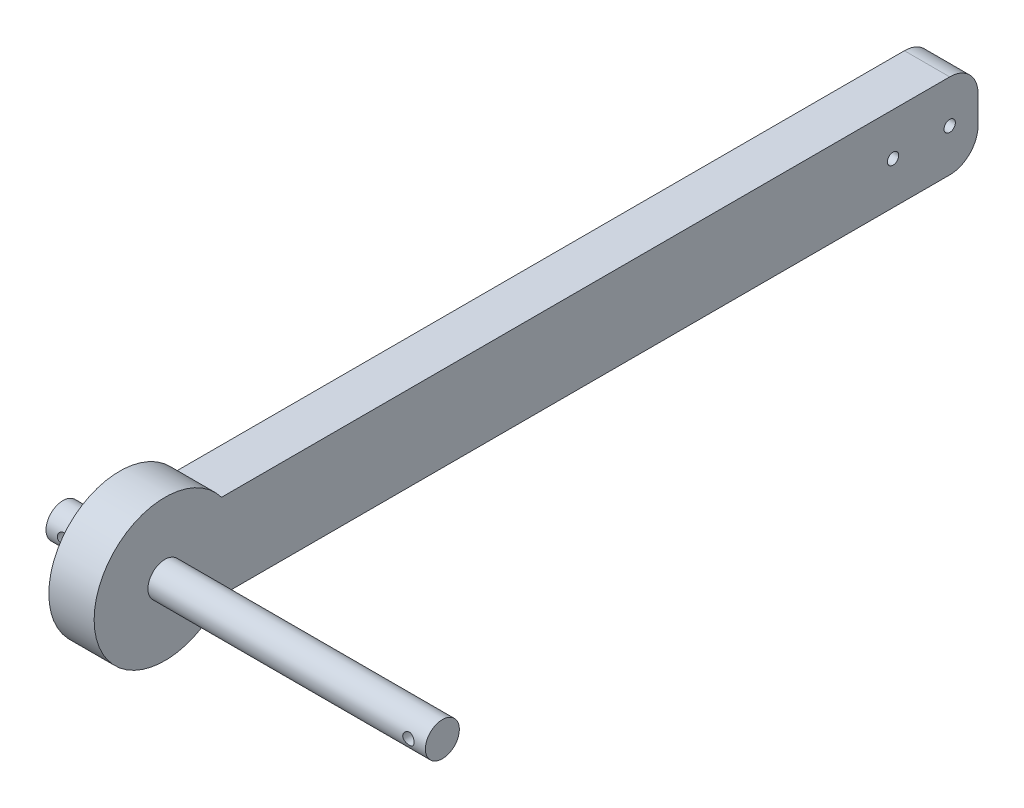
ISO-10303-21;
HEADER;
FILE_DESCRIPTION(('STEP AP214'),'2;1');
FILE_NAME('part.step','',(''),(''),'','','');
FILE_SCHEMA(('AUTOMOTIVE_DESIGN { 1 0 10303 214 1 1 1 1 }'));
ENDSEC;
DATA;
#1=APPLICATION_CONTEXT('core data for automotive mechanical design processes');
#2=APPLICATION_PROTOCOL_DEFINITION('international standard','automotive_design',2000,#1);
#3=PRODUCT_CONTEXT('',#1,'mechanical');
#4=PRODUCT('Part','Part','',(#3));
#5=PRODUCT_RELATED_PRODUCT_CATEGORY('part','',(#4));
#6=PRODUCT_DEFINITION_FORMATION('','',#4);
#7=PRODUCT_DEFINITION_CONTEXT('part definition',#1,'design');
#8=PRODUCT_DEFINITION('design','',#6,#7);
#9=PRODUCT_DEFINITION_SHAPE('','',#8);
#10=(LENGTH_UNIT() NAMED_UNIT(*) SI_UNIT(.MILLI.,.METRE.));
#11=(NAMED_UNIT(*) PLANE_ANGLE_UNIT() SI_UNIT($,.RADIAN.));
#12=(NAMED_UNIT(*) SI_UNIT($,.STERADIAN.) SOLID_ANGLE_UNIT());
#13=UNCERTAINTY_MEASURE_WITH_UNIT(LENGTH_MEASURE(1.E-05),#10,'distance_accuracy_value','');
#14=(GEOMETRIC_REPRESENTATION_CONTEXT(3) GLOBAL_UNCERTAINTY_ASSIGNED_CONTEXT((#13)) GLOBAL_UNIT_ASSIGNED_CONTEXT((#10,
#11,#12)) REPRESENTATION_CONTEXT('',''));
#15=CARTESIAN_POINT('',(0.,0.,0.));
#16=DIRECTION('',(0.,0.,1.));
#17=DIRECTION('',(1.,0.,0.));
#18=AXIS2_PLACEMENT_3D('',#15,#16,#17);
#19=CARTESIAN_POINT('',(8.,0.,0.));
#20=DIRECTION('',(0.,1.,0.));
#21=DIRECTION('',(0.,0.,1.));
#22=AXIS2_PLACEMENT_3D('',#19,#20,#21);
#23=PLANE('',#22);
#24=DIRECTION('',(0.,0.,-1.));
#25=VECTOR('',#24,1.);
#26=CARTESIAN_POINT('',(8.,0.,0.));
#27=LINE('',#26,#25);
#28=CARTESIAN_POINT('',(8.,0.,-16.4));
#29=VERTEX_POINT('',#28);
#30=CARTESIAN_POINT('',(8.,0.,-145.));
#31=VERTEX_POINT('',#30);
#32=EDGE_CURVE('E63',#29,#31,#27,.T.);
#33=ORIENTED_EDGE('',*,*,#32,.F.);
#34=DIRECTION('',(1.,0.,0.));
#35=VECTOR('',#34,1.);
#36=CARTESIAN_POINT('',(-35.3553390593274,0.,-16.4));
#37=LINE('',#36,#35);
#38=CARTESIAN_POINT('',(0.,0.,-16.4));
#39=VERTEX_POINT('',#38);
#40=EDGE_CURVE('E100',#29,#39,#37,.F.);
#41=ORIENTED_EDGE('',*,*,#40,.T.);
#42=DIRECTION('',(0.,0.,-1.));
#43=VECTOR('',#42,1.);
#44=CARTESIAN_POINT('',(0.,0.,0.));
#45=LINE('',#44,#43);
#46=CARTESIAN_POINT('',(0.,0.,-145.));
#47=VERTEX_POINT('',#46);
#48=EDGE_CURVE('E122',#39,#47,#45,.T.);
#49=ORIENTED_EDGE('',*,*,#48,.T.);
#50=DIRECTION('',(-1.,0.,0.));
#51=VECTOR('',#50,1.);
#52=CARTESIAN_POINT('',(8.,0.,-145.));
#53=LINE('',#52,#51);
#54=EDGE_CURVE('E135',#47,#31,#53,.F.);
#55=ORIENTED_EDGE('',*,*,#54,.T.);
#56=EDGE_LOOP('',(#33,#41,#49,#55));
#57=FACE_BOUND('',#56,.T.);
#58=ADVANCED_FACE('F41',(#57),#23,.F.);
#59=CARTESIAN_POINT('',(8.,0.,-150.));
#60=DIRECTION('',(0.,0.,1.));
#61=DIRECTION('',(1.,0.,0.));
#62=AXIS2_PLACEMENT_3D('',#59,#60,#61);
#63=PLANE('',#62);
#64=DIRECTION('',(0.,1.,0.));
#65=VECTOR('',#64,1.);
#66=CARTESIAN_POINT('',(8.,0.,-150.));
#67=LINE('',#66,#65);
#68=CARTESIAN_POINT('',(8.,5.,-150.));
#69=VERTEX_POINT('',#68);
#70=CARTESIAN_POINT('',(8.,10.,-150.));
#71=VERTEX_POINT('',#70);
#72=EDGE_CURVE('E115',#69,#71,#67,.T.);
#73=ORIENTED_EDGE('',*,*,#72,.F.);
#74=DIRECTION('',(-1.,0.,0.));
#75=VECTOR('',#74,1.);
#76=CARTESIAN_POINT('',(8.,5.,-150.));
#77=LINE('',#76,#75);
#78=CARTESIAN_POINT('',(0.,5.,-150.));
#79=VERTEX_POINT('',#78);
#80=EDGE_CURVE('E117',#69,#79,#77,.T.);
#81=ORIENTED_EDGE('',*,*,#80,.T.);
#82=DIRECTION('',(0.,1.,0.));
#83=VECTOR('',#82,1.);
#84=CARTESIAN_POINT('',(0.,0.,-150.));
#85=LINE('',#84,#83);
#86=CARTESIAN_POINT('',(0.,10.,-150.));
#87=VERTEX_POINT('',#86);
#88=EDGE_CURVE('E124',#79,#87,#85,.T.);
#89=ORIENTED_EDGE('',*,*,#88,.T.);
#90=DIRECTION('',(-1.,0.,0.));
#91=VECTOR('',#90,1.);
#92=CARTESIAN_POINT('',(8.,10.,-150.));
#93=LINE('',#92,#91);
#94=EDGE_CURVE('E114',#87,#71,#93,.F.);
#95=ORIENTED_EDGE('',*,*,#94,.T.);
#96=EDGE_LOOP('',(#73,#81,#89,#95));
#97=FACE_BOUND('',#96,.T.);
#98=ADVANCED_FACE('F155',(#97),#63,.F.);
#99=CARTESIAN_POINT('',(8.,15.,0.));
#100=DIRECTION('',(0.,-1.,0.));
#101=DIRECTION('',(0.,0.,-1.));
#102=AXIS2_PLACEMENT_3D('',#99,#100,#101);
#103=PLANE('',#102);
#104=DIRECTION('',(0.,0.,1.));
#105=VECTOR('',#104,1.);
#106=CARTESIAN_POINT('',(0.,15.,0.));
#107=LINE('',#106,#105);
#108=CARTESIAN_POINT('',(0.,15.,-145.));
#109=VERTEX_POINT('',#108);
#110=CARTESIAN_POINT('',(0.,15.,-16.4));
#111=VERTEX_POINT('',#110);
#112=EDGE_CURVE('E111',#109,#111,#107,.T.);
#113=ORIENTED_EDGE('',*,*,#112,.T.);
#114=DIRECTION('',(1.,0.,0.));
#115=VECTOR('',#114,1.);
#116=CARTESIAN_POINT('',(-35.3553390593274,15.,-16.4));
#117=LINE('',#116,#115);
#118=CARTESIAN_POINT('',(8.,15.,-16.4));
#119=VERTEX_POINT('',#118);
#120=EDGE_CURVE('E97',#111,#119,#117,.T.);
#121=ORIENTED_EDGE('',*,*,#120,.T.);
#122=DIRECTION('',(0.,0.,1.));
#123=VECTOR('',#122,1.);
#124=CARTESIAN_POINT('',(8.,15.,0.));
#125=LINE('',#124,#123);
#126=CARTESIAN_POINT('',(8.,15.,-145.));
#127=VERTEX_POINT('',#126);
#128=EDGE_CURVE('E108',#127,#119,#125,.T.);
#129=ORIENTED_EDGE('',*,*,#128,.F.);
#130=DIRECTION('',(-1.,0.,0.));
#131=VECTOR('',#130,1.);
#132=CARTESIAN_POINT('',(8.,15.,-145.));
#133=LINE('',#132,#131);
#134=EDGE_CURVE('E49',#127,#109,#133,.T.);
#135=ORIENTED_EDGE('',*,*,#134,.T.);
#136=EDGE_LOOP('',(#113,#121,#129,#135));
#137=FACE_BOUND('',#136,.T.);
#138=ADVANCED_FACE('F106',(#137),#103,.F.);
#139=CARTESIAN_POINT('',(8.,0.,0.));
#140=DIRECTION('',(-1.,0.,0.));
#141=DIRECTION('',(0.,0.,1.));
#142=AXIS2_PLACEMENT_3D('',#139,#140,#141);
#143=PLANE('',#142);
#144=CARTESIAN_POINT('',(8.,7.5,-6.4));
#145=DIRECTION('',(-1.,0.,0.));
#146=DIRECTION('',(0.,0.,1.));
#147=AXIS2_PLACEMENT_3D('',#144,#145,#146);
#148=CIRCLE('',#147,3.);
#149=CARTESIAN_POINT('',(8.,7.5,-3.4));
#150=VERTEX_POINT('',#149);
#151=EDGE_CURVE('E229',#150,#150,#148,.T.);
#152=ORIENTED_EDGE('',*,*,#151,.T.);
#153=EDGE_LOOP('',(#152));
#154=FACE_BOUND('',#153,.T.);
#155=CARTESIAN_POINT('',(8.,7.5,-145.));
#156=DIRECTION('',(-1.,0.,0.));
#157=DIRECTION('',(0.,0.,1.));
#158=AXIS2_PLACEMENT_3D('',#155,#156,#157);
#159=CIRCLE('',#158,0.999999999999998);
#160=CARTESIAN_POINT('',(8.,7.5,-144.));
#161=VERTEX_POINT('',#160);
#162=EDGE_CURVE('E102',#161,#161,#159,.T.);
#163=ORIENTED_EDGE('',*,*,#162,.T.);
#164=EDGE_LOOP('',(#163));
#165=FACE_BOUND('',#164,.T.);
#166=CARTESIAN_POINT('',(8.,7.5,-135.));
#167=DIRECTION('',(-1.,0.,0.));
#168=DIRECTION('',(0.,0.,1.));
#169=AXIS2_PLACEMENT_3D('',#166,#167,#168);
#170=CIRCLE('',#169,0.999999999999998);
#171=CARTESIAN_POINT('',(8.,7.5,-134.));
#172=VERTEX_POINT('',#171);
#173=EDGE_CURVE('E236',#172,#172,#170,.T.);
#174=ORIENTED_EDGE('',*,*,#173,.T.);
#175=EDGE_LOOP('',(#174));
#176=FACE_BOUND('',#175,.T.);
#177=CARTESIAN_POINT('',(8.,7.5,-6.4));
#178=DIRECTION('',(1.,0.,0.));
#179=DIRECTION('',(0.,0.,-1.));
#180=AXIS2_PLACEMENT_3D('',#177,#178,#179);
#181=CIRCLE('',#180,12.5);
#182=EDGE_CURVE('E94',#119,#29,#181,.T.);
#183=ORIENTED_EDGE('',*,*,#182,.T.);
#184=ORIENTED_EDGE('',*,*,#32,.T.);
#185=CARTESIAN_POINT('',(8.,5.,-145.));
#186=DIRECTION('',(-1.,0.,0.));
#187=DIRECTION('',(0.,0.,1.));
#188=AXIS2_PLACEMENT_3D('',#185,#186,#187);
#189=CIRCLE('',#188,5.);
#190=EDGE_CURVE('E138',#31,#69,#189,.F.);
#191=ORIENTED_EDGE('',*,*,#190,.T.);
#192=ORIENTED_EDGE('',*,*,#72,.T.);
#193=CARTESIAN_POINT('',(8.,10.,-145.));
#194=DIRECTION('',(-1.,0.,0.));
#195=DIRECTION('',(0.,0.,1.));
#196=AXIS2_PLACEMENT_3D('',#193,#194,#195);
#197=CIRCLE('',#196,5.);
#198=EDGE_CURVE('E56',#71,#127,#197,.F.);
#199=ORIENTED_EDGE('',*,*,#198,.T.);
#200=ORIENTED_EDGE('',*,*,#128,.T.);
#201=EDGE_LOOP('',(#183,#184,#191,#192,#199,#200));
#202=FACE_BOUND('',#201,.T.);
#203=ADVANCED_FACE('F113',(#154,#165,#176,#202),#143,.F.);
#204=CARTESIAN_POINT('',(0.,0.,0.));
#205=DIRECTION('',(-1.,0.,0.));
#206=DIRECTION('',(0.,0.,1.));
#207=AXIS2_PLACEMENT_3D('',#204,#205,#206);
#208=PLANE('',#207);
#209=CARTESIAN_POINT('',(0.,7.5,-6.4));
#210=DIRECTION('',(-1.,0.,0.));
#211=DIRECTION('',(0.,0.,1.));
#212=AXIS2_PLACEMENT_3D('',#209,#210,#211);
#213=CIRCLE('',#212,3.);
#214=CARTESIAN_POINT('',(0.,7.5,-3.4));
#215=VERTEX_POINT('',#214);
#216=EDGE_CURVE('E11',#215,#215,#213,.T.);
#217=ORIENTED_EDGE('',*,*,#216,.F.);
#218=EDGE_LOOP('',(#217));
#219=FACE_BOUND('',#218,.T.);
#220=CARTESIAN_POINT('',(0.,7.5,-145.));
#221=DIRECTION('',(-1.,0.,0.));
#222=DIRECTION('',(0.,0.,1.));
#223=AXIS2_PLACEMENT_3D('',#220,#221,#222);
#224=CIRCLE('',#223,0.999999999999998);
#225=CARTESIAN_POINT('',(0.,7.5,-144.));
#226=VERTEX_POINT('',#225);
#227=EDGE_CURVE('E233',#226,#226,#224,.T.);
#228=ORIENTED_EDGE('',*,*,#227,.F.);
#229=EDGE_LOOP('',(#228));
#230=FACE_BOUND('',#229,.T.);
#231=CARTESIAN_POINT('',(0.,7.5,-135.));
#232=DIRECTION('',(-1.,0.,0.));
#233=DIRECTION('',(0.,0.,1.));
#234=AXIS2_PLACEMENT_3D('',#231,#232,#233);
#235=CIRCLE('',#234,0.999999999999998);
#236=CARTESIAN_POINT('',(0.,7.5,-134.));
#237=VERTEX_POINT('',#236);
#238=EDGE_CURVE('E232',#237,#237,#235,.T.);
#239=ORIENTED_EDGE('',*,*,#238,.F.);
#240=EDGE_LOOP('',(#239));
#241=FACE_BOUND('',#240,.T.);
#242=ORIENTED_EDGE('',*,*,#48,.F.);
#243=CARTESIAN_POINT('',(0.,7.5,-6.4));
#244=DIRECTION('',(-1.,0.,0.));
#245=DIRECTION('',(0.,0.,1.));
#246=AXIS2_PLACEMENT_3D('',#243,#244,#245);
#247=CIRCLE('',#246,12.5);
#248=EDGE_CURVE('E101',#111,#39,#247,.F.);
#249=ORIENTED_EDGE('',*,*,#248,.F.);
#250=ORIENTED_EDGE('',*,*,#112,.F.);
#251=CARTESIAN_POINT('',(0.,10.,-145.));
#252=DIRECTION('',(-1.,0.,0.));
#253=DIRECTION('',(0.,0.,1.));
#254=AXIS2_PLACEMENT_3D('',#251,#252,#253);
#255=CIRCLE('',#254,5.);
#256=EDGE_CURVE('E130',#109,#87,#255,.T.);
#257=ORIENTED_EDGE('',*,*,#256,.T.);
#258=ORIENTED_EDGE('',*,*,#88,.F.);
#259=CARTESIAN_POINT('',(0.,5.,-145.));
#260=DIRECTION('',(-1.,0.,0.));
#261=DIRECTION('',(0.,0.,1.));
#262=AXIS2_PLACEMENT_3D('',#259,#260,#261);
#263=CIRCLE('',#262,5.);
#264=EDGE_CURVE('E132',#79,#47,#263,.T.);
#265=ORIENTED_EDGE('',*,*,#264,.T.);
#266=EDGE_LOOP('',(#242,#249,#250,#257,#258,#265));
#267=FACE_BOUND('',#266,.T.);
#268=ADVANCED_FACE('F142',(#219,#230,#241,#267),#208,.T.);
#269=CARTESIAN_POINT('',(8.,5.,-145.));
#270=DIRECTION('',(-1.,0.,0.));
#271=DIRECTION('',(0.,0.,1.));
#272=AXIS2_PLACEMENT_3D('',#269,#270,#271);
#273=CYLINDRICAL_SURFACE('',#272,5.);
#274=ORIENTED_EDGE('',*,*,#190,.F.);
#275=ORIENTED_EDGE('',*,*,#54,.F.);
#276=ORIENTED_EDGE('',*,*,#264,.F.);
#277=ORIENTED_EDGE('',*,*,#80,.F.);
#278=EDGE_LOOP('',(#274,#275,#276,#277));
#279=FACE_BOUND('',#278,.T.);
#280=ADVANCED_FACE('F152',(#279),#273,.T.);
#281=CARTESIAN_POINT('',(8.,10.,-145.));
#282=DIRECTION('',(-1.,0.,0.));
#283=DIRECTION('',(0.,0.,1.));
#284=AXIS2_PLACEMENT_3D('',#281,#282,#283);
#285=CYLINDRICAL_SURFACE('',#284,5.);
#286=ORIENTED_EDGE('',*,*,#198,.F.);
#287=ORIENTED_EDGE('',*,*,#94,.F.);
#288=ORIENTED_EDGE('',*,*,#256,.F.);
#289=ORIENTED_EDGE('',*,*,#134,.F.);
#290=EDGE_LOOP('',(#286,#287,#288,#289));
#291=FACE_BOUND('',#290,.T.);
#292=ADVANCED_FACE('F43',(#291),#285,.T.);
#293=CARTESIAN_POINT('',(-35.3553390593274,7.5,-6.4));
#294=DIRECTION('',(1.,0.,0.));
#295=DIRECTION('',(0.,0.,-1.));
#296=AXIS2_PLACEMENT_3D('',#293,#294,#295);
#297=CYLINDRICAL_SURFACE('',#296,12.5);
#298=ORIENTED_EDGE('',*,*,#40,.F.);
#299=ORIENTED_EDGE('',*,*,#182,.F.);
#300=ORIENTED_EDGE('',*,*,#120,.F.);
#301=ORIENTED_EDGE('',*,*,#248,.T.);
#302=EDGE_LOOP('',(#298,#299,#300,#301));
#303=FACE_BOUND('',#302,.T.);
#304=ADVANCED_FACE('F96',(#303),#297,.T.);
#305=CARTESIAN_POINT('',(10.,7.5,-135.));
#306=DIRECTION('',(-1.,0.,0.));
#307=DIRECTION('',(0.,0.,1.));
#308=AXIS2_PLACEMENT_3D('',#305,#306,#307);
#309=CYLINDRICAL_SURFACE('',#308,0.999999999999998);
#310=ORIENTED_EDGE('',*,*,#238,.T.);
#311=EDGE_LOOP('',(#310));
#312=FACE_BOUND('',#311,.T.);
#313=ORIENTED_EDGE('',*,*,#173,.F.);
#314=EDGE_LOOP('',(#313));
#315=FACE_BOUND('',#314,.T.);
#316=ADVANCED_FACE('F162',(#312,#315),#309,.F.);
#317=CARTESIAN_POINT('',(10.,7.5,-145.));
#318=DIRECTION('',(-1.,0.,0.));
#319=DIRECTION('',(0.,0.,1.));
#320=AXIS2_PLACEMENT_3D('',#317,#318,#319);
#321=CYLINDRICAL_SURFACE('',#320,0.999999999999998);
#322=ORIENTED_EDGE('',*,*,#227,.T.);
#323=EDGE_LOOP('',(#322));
#324=FACE_BOUND('',#323,.T.);
#325=ORIENTED_EDGE('',*,*,#162,.F.);
#326=EDGE_LOOP('',(#325));
#327=FACE_BOUND('',#326,.T.);
#328=ADVANCED_FACE('F181',(#324,#327),#321,.F.);
#329=CARTESIAN_POINT('',(-10.,7.5,-6.4));
#330=DIRECTION('',(-1.,0.,0.));
#331=DIRECTION('',(0.,0.,1.));
#332=AXIS2_PLACEMENT_3D('',#329,#330,#331);
#333=PLANE('',#332);
#334=CARTESIAN_POINT('',(-10.,7.5,-6.4));
#335=DIRECTION('',(-1.,0.,0.));
#336=DIRECTION('',(0.,0.,1.));
#337=AXIS2_PLACEMENT_3D('',#334,#335,#336);
#338=CIRCLE('',#337,3.);
#339=CARTESIAN_POINT('',(-10.,7.5,-3.4));
#340=VERTEX_POINT('',#339);
#341=EDGE_CURVE('E222',#340,#340,#338,.T.);
#342=ORIENTED_EDGE('',*,*,#341,.T.);
#343=EDGE_LOOP('',(#342));
#344=FACE_BOUND('',#343,.T.);
#345=ADVANCED_FACE('F185',(#344),#333,.T.);
#346=CARTESIAN_POINT('',(57.,7.5,-6.4));
#347=DIRECTION('',(-1.,0.,0.));
#348=DIRECTION('',(0.,0.,1.));
#349=AXIS2_PLACEMENT_3D('',#346,#347,#348);
#350=CYLINDRICAL_SURFACE('',#349,3.);
#351=CARTESIAN_POINT('',(-6.,7.49999999999999,-3.39999999999996));
#352=CARTESIAN_POINT('',(-5.99999974626836,7.44543663711327,-3.39999984699053));
#353=CARTESIAN_POINT('',(-6.00448026612722,7.39087480546144,-3.40150230492455));
#354=CARTESIAN_POINT('',(-6.02222910881722,7.28335823912702,-3.4073478979672));
#355=CARTESIAN_POINT('',(-6.03549834394892,7.23040367188118,-3.41169132797848));
#356=CARTESIAN_POINT('',(-6.07031924338405,7.12766721049822,-3.42274692093557));
#357=CARTESIAN_POINT('',(-6.09185706245927,7.07788017411396,-3.42945512269147));
#358=CARTESIAN_POINT('',(-6.14254117283835,6.98262506319467,-3.44455554282659));
#359=CARTESIAN_POINT('',(-6.1716889650026,6.93715784304129,-3.45294809332222));
#360=CARTESIAN_POINT('',(-6.23782580485875,6.85025832497773,-3.47085905556995));
#361=CARTESIAN_POINT('',(-6.27503123426049,6.80899629970169,-3.48040443536215));
#362=CARTESIAN_POINT('',(-6.35576715470656,6.73316730729791,-3.49939685216879));
#363=CARTESIAN_POINT('',(-6.39929903492851,6.69860181451053,-3.50884386709451));
#364=CARTESIAN_POINT('',(-6.49298511519646,6.63617505777213,-3.52686667522727));
#365=CARTESIAN_POINT('',(-6.54329373973212,6.60853514177896,-3.53540960724312));
#366=CARTESIAN_POINT('',(-6.64817609445854,6.56218112612227,-3.55024694581399));
#367=CARTESIAN_POINT('',(-6.70274851716274,6.54346430261323,-3.55654203839255));
#368=CARTESIAN_POINT('',(-6.81267322149671,6.51612653849083,-3.56588696730623));
#369=CARTESIAN_POINT('',(-6.86793720848906,6.50718655172822,-3.56903904230389));
#370=CARTESIAN_POINT('',(-6.97926375415588,6.49865887666551,-3.57204343370493));
#371=CARTESIAN_POINT('',(-7.03532606070919,6.49906829839527,-3.5718967697727));
#372=CARTESIAN_POINT('',(-7.14393663044402,6.50898009629657,-3.5684098499182));
#373=CARTESIAN_POINT('',(-7.19652840291902,6.518066086833,-3.56521584132468));
#374=CARTESIAN_POINT('',(-7.29939341960683,6.54439383715057,-3.5562334227545));
#375=CARTESIAN_POINT('',(-7.34966638543507,6.56163657340812,-3.55044470215893));
#376=CARTESIAN_POINT('',(-7.44741274959148,6.60406094193978,-3.53682088868752));
#377=CARTESIAN_POINT('',(-7.49482802546953,6.62936595129273,-3.52895434206883));
#378=CARTESIAN_POINT('',(-7.58487090827973,6.68711089369685,-3.51207441424274));
#379=CARTESIAN_POINT('',(-7.62749712693338,6.71955288763598,-3.50306070209537));
#380=CARTESIAN_POINT('',(-7.70909159816077,6.79265066731775,-3.4843267083226));
#381=CARTESIAN_POINT('',(-7.74775269450907,6.83364684992368,-3.47459410645158));
#382=CARTESIAN_POINT('',(-7.8177312666634,6.92166043002992,-3.45593061612964));
#383=CARTESIAN_POINT('',(-7.8490480381645,6.96867840433917,-3.44699980461933));
#384=CARTESIAN_POINT('',(-7.90369630023507,7.06805238695372,-3.43082892062207));
#385=CARTESIAN_POINT('',(-7.92694549134073,7.12045672358365,-3.42360649991961));
#386=CARTESIAN_POINT('',(-7.96420317395571,7.22873091663548,-3.41179432855566));
#387=CARTESIAN_POINT('',(-7.97821487542344,7.28459956184503,-3.40720366345122));
#388=CARTESIAN_POINT('',(-7.99605566602236,7.39561617047068,-3.40132372928559));
#389=CARTESIAN_POINT('',(-8.00029980917275,7.45069040013514,-3.39989998166269));
#390=CARTESIAN_POINT('',(-7.99966732640154,7.56077506996022,-3.40011097305175));
#391=CARTESIAN_POINT('',(-7.99479224002013,7.61578551931964,-3.40174519580648));
#392=CARTESIAN_POINT('',(-7.97638809226404,7.72251986630425,-3.40779975282886));
#393=CARTESIAN_POINT('',(-7.96311379395048,7.77429280683484,-3.41213801288772));
#394=CARTESIAN_POINT('',(-7.9286065555333,7.87485595857955,-3.42308153169966));
#395=CARTESIAN_POINT('',(-7.90737260053233,7.92364578850855,-3.42968707953459));
#396=CARTESIAN_POINT('',(-7.8569295681591,8.01828829639331,-3.44471068712573));
#397=CARTESIAN_POINT('',(-7.8275254067164,8.06402995921732,-3.45317185243695));
#398=CARTESIAN_POINT('',(-7.76180584998695,8.1500648301354,-3.47094746084257));
#399=CARTESIAN_POINT('',(-7.72548834396984,8.19035636779489,-3.48026216408112));
#400=CARTESIAN_POINT('',(-7.64502124899174,8.26625250780701,-3.49923152017528));
#401=CARTESIAN_POINT('',(-7.60059077306676,8.30156096924848,-3.50888238904845));
#402=CARTESIAN_POINT('',(-7.5062284321955,8.36425752232084,-3.52700026713019));
#403=CARTESIAN_POINT('',(-7.4562965213898,8.39164554792083,-3.5354672664688));
#404=CARTESIAN_POINT('',(-7.35232698469341,8.43759693042335,-3.55017608179692));
#405=CARTESIAN_POINT('',(-7.29829792075723,8.45617813219776,-3.55642239099368));
#406=CARTESIAN_POINT('',(-7.18762134987586,8.48389466679215,-3.56589167600867));
#407=CARTESIAN_POINT('',(-7.13097503456694,8.49303425496123,-3.56911601377302));
#408=CARTESIAN_POINT('',(-7.01980290398679,8.50127628247037,-3.57202141124929));
#409=CARTESIAN_POINT('',(-6.96531765974827,8.50087025731092,-3.57187599655701));
#410=CARTESIAN_POINT('',(-6.85723492510026,8.49124229345487,-3.5684873007644));
#411=CARTESIAN_POINT('',(-6.80363738204709,8.48202087945888,-3.56524420404116));
#412=CARTESIAN_POINT('',(-6.69986433698734,8.45537181312697,-3.55615475721057));
#413=CARTESIAN_POINT('',(-6.64964317499277,8.43810334601487,-3.55035901984486));
#414=CARTESIAN_POINT('',(-6.55277259306447,8.39597936576038,-3.53683601174566));
#415=CARTESIAN_POINT('',(-6.50612396881275,8.37112216855397,-3.52910831234703));
#416=CARTESIAN_POINT('',(-6.41551633007631,8.31326069258324,-3.5121717077594));
#417=CARTESIAN_POINT('',(-6.37176349810141,8.27994824276453,-3.50291288358396));
#418=CARTESIAN_POINT('',(-6.29031018661601,8.20664288313569,-3.48416643716214));
#419=CARTESIAN_POINT('',(-6.25261142431199,8.16664808445149,-3.47467875087482));
#420=CARTESIAN_POINT('',(-6.18285558771076,8.07924155692067,-3.45609969474607));
#421=CARTESIAN_POINT('',(-6.15107565224899,8.03160151349972,-3.44703818198784));
#422=CARTESIAN_POINT('',(-6.09600957114937,7.93135735740662,-3.43074008827348));
#423=CARTESIAN_POINT('',(-6.07272125407796,7.87875451813234,-3.42350304092059));
#424=CARTESIAN_POINT('',(-6.03627836751132,7.77249364720097,-3.41194484931469));
#425=CARTESIAN_POINT('',(-6.02271753373662,7.7189877576764,-3.40750787577481));
#426=CARTESIAN_POINT('',(-6.00457971932287,7.61032041601024,-3.40153592935774));
#427=CARTESIAN_POINT('',(-6.00000025650346,7.55515942556874,-3.4000001546809));
#428=CARTESIAN_POINT('',(-6.,7.49999999999999,-3.39999999999996));
#429=B_SPLINE_CURVE_WITH_KNOTS('',3,(#351,#352,#353,#354,#355,#356,#357,#358,#359,#360,#361,
#362,#363,#364,#365,#366,#367,#368,#369,#370,#371,#372,#373,#374,#375,#376,#377,#378,#379,#380,
#381,#382,#383,#384,#385,#386,#387,#388,#389,#390,#391,#392,#393,#394,#395,#396,#397,#398,#399,
#400,#401,#402,#403,#404,#405,#406,#407,#408,#409,#410,#411,#412,#413,#414,#415,#416,#417,#418,
#419,#420,#421,#422,#423,#424,#425,#426,#427,#428),.UNSPECIFIED.,.T.,.F.,(4,2,2,2,2,2,2,2,2,2,2,
2,2,2,2,2,2,2,2,2,2,2,2,2,2,2,2,2,2,2,2,2,2,2,2,2,2,2,4),(0.,0.163487106026009,0.32699118526752,
0.490222672870273,0.653486377799097,0.821846842827557,0.9902443328753,1.1634838482347,
1.33667044692833,1.5040192574184,1.67131633987485,1.8309682655128,1.99063930855482,
2.15288171155131,2.31517102558207,2.48593305811367,2.65671145966618,2.82918405650357,
3.00159668877208,3.1665358317517,3.33144713164177,3.49158157978213,3.65173645284104,
3.81610399843737,3.98052180821891,4.15241022880752,4.32430008234997,4.49584013824416,
4.66730284700846,4.82995666056619,4.99260079341185,5.15215587070228,5.31174638165788,
5.47830066681615,5.64490211113589,5.81799660824911,5.99104681142267,6.15636558363624,
6.3216386602795),.UNSPECIFIED.);
#430=CARTESIAN_POINT('',(-6.,7.49999999999999,-3.39999999999996));
#431=VERTEX_POINT('',#430);
#432=EDGE_CURVE('E221',#431,#431,#429,.T.);
#433=ORIENTED_EDGE('',*,*,#432,.T.);
#434=EDGE_LOOP('',(#433));
#435=FACE_BOUND('',#434,.T.);
#436=CARTESIAN_POINT('',(-6.,7.49999999999999,-9.39999999999996));
#437=CARTESIAN_POINT('',(-5.99999974626836,7.55456336288672,-9.4000001530094));
#438=CARTESIAN_POINT('',(-6.00448026612722,7.60912519453854,-9.39849769507544));
#439=CARTESIAN_POINT('',(-6.02222910881722,7.71664176087297,-9.39265210203282));
#440=CARTESIAN_POINT('',(-6.03549834394892,7.76959632811881,-9.38830867202153));
#441=CARTESIAN_POINT('',(-6.07031924338405,7.87233278950177,-9.37725307906443));
#442=CARTESIAN_POINT('',(-6.09185706245927,7.92211982588603,-9.37054487730854));
#443=CARTESIAN_POINT('',(-6.14254117283835,8.01737493680532,-9.35544445717342));
#444=CARTESIAN_POINT('',(-6.1716889650026,8.0628421569587,-9.34705190667778));
#445=CARTESIAN_POINT('',(-6.23782580485876,8.14974167502226,-9.32914094443005));
#446=CARTESIAN_POINT('',(-6.2750312342605,8.1910037002983,-9.31959556463785));
#447=CARTESIAN_POINT('',(-6.35576715470657,8.26683269270208,-9.30060314783122));
#448=CARTESIAN_POINT('',(-6.39929903492852,8.30139818548946,-9.29115613290549));
#449=CARTESIAN_POINT('',(-6.49298511519646,8.36382494222785,-9.27313332477274));
#450=CARTESIAN_POINT('',(-6.54329373973213,8.39146485822103,-9.26459039275688));
#451=CARTESIAN_POINT('',(-6.64817609445855,8.43781887387772,-9.24975305418601));
#452=CARTESIAN_POINT('',(-6.70274851716275,8.45653569738676,-9.24345796160746));
#453=CARTESIAN_POINT('',(-6.81267322149672,8.48387346150916,-9.23411303269378));
#454=CARTESIAN_POINT('',(-6.86793720848907,8.49281344827176,-9.23096095769612));
#455=CARTESIAN_POINT('',(-6.97926375415589,8.50134112333447,-9.22795656629508));
#456=CARTESIAN_POINT('',(-7.0353260607092,8.50093170160471,-9.22810323022731));
#457=CARTESIAN_POINT('',(-7.14393663044403,8.49101990370341,-9.23159015008181));
#458=CARTESIAN_POINT('',(-7.19652840291902,8.48193391316699,-9.23478415867533));
#459=CARTESIAN_POINT('',(-7.29939341960684,8.45560616284941,-9.24376657724551));
#460=CARTESIAN_POINT('',(-7.34966638543508,8.43836342659186,-9.24955529784108));
#461=CARTESIAN_POINT('',(-7.44741274959148,8.3959390580602,-9.26317911131249));
#462=CARTESIAN_POINT('',(-7.49482802546953,8.37063404870725,-9.27104565793118));
#463=CARTESIAN_POINT('',(-7.58487090827973,8.31288910630313,-9.28792558575727));
#464=CARTESIAN_POINT('',(-7.62749712693339,8.28044711236399,-9.29693929790464));
#465=CARTESIAN_POINT('',(-7.70909159816078,8.20734933268223,-9.31567329167741));
#466=CARTESIAN_POINT('',(-7.74775269450907,8.1663531500763,-9.32540589354843));
#467=CARTESIAN_POINT('',(-7.8177312666634,8.07833956997005,-9.34406938387037));
#468=CARTESIAN_POINT('',(-7.8490480381645,8.0313215956608,-9.35300019538068));
#469=CARTESIAN_POINT('',(-7.90369630023507,7.93194761304626,-9.36917107937794));
#470=CARTESIAN_POINT('',(-7.92694549134074,7.87954327641633,-9.3763935000804));
#471=CARTESIAN_POINT('',(-7.96420317395571,7.7712690833645,-9.38820567144435));
#472=CARTESIAN_POINT('',(-7.97821487542344,7.71540043815494,-9.39279633654879));
#473=CARTESIAN_POINT('',(-7.99605566602236,7.60438382952929,-9.39867627071441));
#474=CARTESIAN_POINT('',(-8.00029980917275,7.54930959986483,-9.40010001833731));
#475=CARTESIAN_POINT('',(-7.99966732640154,7.43922493003975,-9.39988902694825));
#476=CARTESIAN_POINT('',(-7.99479224002013,7.38421448068034,-9.39825480419352));
#477=CARTESIAN_POINT('',(-7.97638809226403,7.27748013369573,-9.39220024717114));
#478=CARTESIAN_POINT('',(-7.96311379395048,7.22570719316513,-9.38786198711228));
#479=CARTESIAN_POINT('',(-7.9286065555333,7.12514404142043,-9.37691846830034));
#480=CARTESIAN_POINT('',(-7.90737260053232,7.07635421149143,-9.37031292046541));
#481=CARTESIAN_POINT('',(-7.8569295681591,6.98171170360667,-9.35528931287427));
#482=CARTESIAN_POINT('',(-7.8275254067164,6.93597004078266,-9.34682814756305));
#483=CARTESIAN_POINT('',(-7.76180584998694,6.84993516986458,-9.32905253915743));
#484=CARTESIAN_POINT('',(-7.72548834396984,6.80964363220509,-9.31973783591888));
#485=CARTESIAN_POINT('',(-7.64502124899173,6.73374749219297,-9.30076847982472));
#486=CARTESIAN_POINT('',(-7.60059077306675,6.6984390307515,-9.29111761095155));
#487=CARTESIAN_POINT('',(-7.5062284321955,6.63574247767913,-9.27299973286981));
#488=CARTESIAN_POINT('',(-7.45629652138979,6.60835445207915,-9.2645327335312));
#489=CARTESIAN_POINT('',(-7.3523269846934,6.56240306957663,-9.24982391820308));
#490=CARTESIAN_POINT('',(-7.29829792075722,6.54382186780222,-9.24357760900632));
#491=CARTESIAN_POINT('',(-7.18762134987585,6.51610533320783,-9.23410832399133));
#492=CARTESIAN_POINT('',(-7.13097503456693,6.50696574503875,-9.23088398622698));
#493=CARTESIAN_POINT('',(-7.01980290398679,6.49872371752961,-9.22797858875071));
#494=CARTESIAN_POINT('',(-6.96531765974826,6.49912974268906,-9.22812400344299));
#495=CARTESIAN_POINT('',(-6.85723492510026,6.50875770654511,-9.2315126992356));
#496=CARTESIAN_POINT('',(-6.80363738204709,6.5179791205411,-9.23475579595884));
#497=CARTESIAN_POINT('',(-6.69986433698733,6.54462818687301,-9.24384524278944));
#498=CARTESIAN_POINT('',(-6.64964317499277,6.56189665398511,-9.24964098015514));
#499=CARTESIAN_POINT('',(-6.55277259306447,6.60402063423961,-9.26316398825434));
#500=CARTESIAN_POINT('',(-6.50612396881274,6.62887783144601,-9.27089168765297));
#501=CARTESIAN_POINT('',(-6.41551633007631,6.68673930741674,-9.2878282922406));
#502=CARTESIAN_POINT('',(-6.3717634981014,6.72005175723546,-9.29708711641604));
#503=CARTESIAN_POINT('',(-6.29031018661601,6.7933571168643,-9.31583356283786));
#504=CARTESIAN_POINT('',(-6.25261142431198,6.8333519155485,-9.32532124912518));
#505=CARTESIAN_POINT('',(-6.18285558771076,6.92075844307932,-9.34390030525393));
#506=CARTESIAN_POINT('',(-6.15107565224898,6.96839848650027,-9.35296181801216));
#507=CARTESIAN_POINT('',(-6.09600957114937,7.06864264259337,-9.36925991172652));
#508=CARTESIAN_POINT('',(-6.07272125407796,7.12124548186765,-9.3764969590794));
#509=CARTESIAN_POINT('',(-6.03627836751132,7.22750635279902,-9.38805515068532));
#510=CARTESIAN_POINT('',(-6.02271753373662,7.28101224232358,-9.39249212422521));
#511=CARTESIAN_POINT('',(-6.00457971932288,7.38967958398975,-9.39846407064224));
#512=CARTESIAN_POINT('',(-6.00000025650346,7.44484057443125,-9.39999984531902));
#513=CARTESIAN_POINT('',(-6.,7.49999999999999,-9.39999999999996));
#514=B_SPLINE_CURVE_WITH_KNOTS('',3,(#436,#437,#438,#439,#440,#441,#442,#443,#444,#445,#446,
#447,#448,#449,#450,#451,#452,#453,#454,#455,#456,#457,#458,#459,#460,#461,#462,#463,#464,#465,
#466,#467,#468,#469,#470,#471,#472,#473,#474,#475,#476,#477,#478,#479,#480,#481,#482,#483,#484,
#485,#486,#487,#488,#489,#490,#491,#492,#493,#494,#495,#496,#497,#498,#499,#500,#501,#502,#503,
#504,#505,#506,#507,#508,#509,#510,#511,#512,#513),.UNSPECIFIED.,.T.,.F.,(4,2,2,2,2,2,2,2,2,2,2,
2,2,2,2,2,2,2,2,2,2,2,2,2,2,2,2,2,2,2,2,2,2,2,2,2,2,2,4),(0.,0.163487106026012,
0.326991185267521,0.490222672870276,0.653486377799104,0.821846842827563,0.990244332875305,
1.16348384823471,1.33667044692834,1.50401925741841,1.67131633987486,1.83096826551281,
1.99063930855482,2.15288171155131,2.31517102558208,2.48593305811367,2.65671145966619,
2.82918405650358,3.00159668877209,3.1665358317517,3.33144713164177,3.49158157978214,
3.65173645284104,3.81610399843737,3.98052180821892,4.15241022880752,4.32430008234997,
4.49584013824417,4.66730284700846,4.82995666056619,4.99260079341185,5.15215587070228,
5.31174638165788,5.47830066681615,5.64490211113589,5.81799660824911,5.99104681142267,
6.15636558363624,6.3216386602795),.UNSPECIFIED.);
#515=CARTESIAN_POINT('',(-6.,7.49999999999999,-9.39999999999996));
#516=VERTEX_POINT('',#515);
#517=EDGE_CURVE('E226',#516,#516,#514,.T.);
#518=ORIENTED_EDGE('',*,*,#517,.T.);
#519=EDGE_LOOP('',(#518));
#520=FACE_BOUND('',#519,.T.);
#521=ORIENTED_EDGE('',*,*,#216,.T.);
#522=EDGE_LOOP('',(#521));
#523=FACE_BOUND('',#522,.T.);
#524=ORIENTED_EDGE('',*,*,#341,.F.);
#525=EDGE_LOOP('',(#524));
#526=FACE_BOUND('',#525,.T.);
#527=ADVANCED_FACE('F187',(#435,#520,#523,#526),#350,.T.);
#528=CARTESIAN_POINT('',(55.,7.5,-3.39999999999996));
#529=CARTESIAN_POINT('',(55.0000002537316,7.44543663711328,-3.39999984699053));
#530=CARTESIAN_POINT('',(54.9955197338728,7.39087480546145,-3.40150230492454));
#531=CARTESIAN_POINT('',(54.9777708911828,7.28335823912703,-3.4073478979672));
#532=CARTESIAN_POINT('',(54.9645016560511,7.23040367188118,-3.41169132797848));
#533=CARTESIAN_POINT('',(54.9296807566159,7.12766721049822,-3.42274692093557));
#534=CARTESIAN_POINT('',(54.9081429375407,7.07788017411397,-3.42945512269147));
#535=CARTESIAN_POINT('',(54.8574588271617,6.98262506319468,-3.44455554282658));
#536=CARTESIAN_POINT('',(54.8283110349974,6.9371578430413,-3.45294809332222));
#537=CARTESIAN_POINT('',(54.7621741951412,6.85025832497774,-3.47085905556995));
#538=CARTESIAN_POINT('',(54.7249687657395,6.80899629970169,-3.48040443536215));
#539=CARTESIAN_POINT('',(54.6442328452934,6.73316730729792,-3.49939685216879));
#540=CARTESIAN_POINT('',(54.6007009650715,6.69860181451054,-3.50884386709451));
#541=CARTESIAN_POINT('',(54.5070148848035,6.63617505777214,-3.52686667522726));
#542=CARTESIAN_POINT('',(54.4567062602679,6.60853514177897,-3.53540960724312));
#543=CARTESIAN_POINT('',(54.3518239055415,6.56218112612228,-3.55024694581399));
#544=CARTESIAN_POINT('',(54.2972514828373,6.54346430261324,-3.55654203839255));
#545=CARTESIAN_POINT('',(54.1873267785033,6.51612653849084,-3.56588696730623));
#546=CARTESIAN_POINT('',(54.1320627915109,6.50718655172823,-3.56903904230389));
#547=CARTESIAN_POINT('',(54.0207362458441,6.49865887666552,-3.57204343370493));
#548=CARTESIAN_POINT('',(53.9646739392908,6.49906829839528,-3.5718967697727));
#549=CARTESIAN_POINT('',(53.856063369556,6.50898009629658,-3.5684098499182));
#550=CARTESIAN_POINT('',(53.803471597081,6.51806608683301,-3.56521584132467));
#551=CARTESIAN_POINT('',(53.7006065803932,6.54439383715058,-3.55623342275449));
#552=CARTESIAN_POINT('',(53.6503336145649,6.56163657340813,-3.55044470215893));
#553=CARTESIAN_POINT('',(53.5525872504085,6.60406094193978,-3.53682088868752));
#554=CARTESIAN_POINT('',(53.5051719745305,6.62936595129273,-3.52895434206883));
#555=CARTESIAN_POINT('',(53.4151290917203,6.68711089369686,-3.51207441424274));
#556=CARTESIAN_POINT('',(53.3725028730666,6.71955288763599,-3.50306070209537));
#557=CARTESIAN_POINT('',(53.2909084018392,6.79265066731776,-3.48432670832259));
#558=CARTESIAN_POINT('',(53.2522473054909,6.83364684992369,-3.47459410645157));
#559=CARTESIAN_POINT('',(53.1822687333366,6.92166043002993,-3.45593061612963));
#560=CARTESIAN_POINT('',(53.1509519618355,6.96867840433918,-3.44699980461933));
#561=CARTESIAN_POINT('',(53.0963036997649,7.06805238695373,-3.43082892062207));
#562=CARTESIAN_POINT('',(53.0730545086593,7.12045672358366,-3.42360649991961));
#563=CARTESIAN_POINT('',(53.0357968260443,7.22873091663549,-3.41179432855566));
#564=CARTESIAN_POINT('',(53.0217851245766,7.28459956184504,-3.40720366345122));
#565=CARTESIAN_POINT('',(53.0039443339776,7.39561617047069,-3.40132372928559));
#566=CARTESIAN_POINT('',(52.9997001908273,7.45069040013515,-3.39989998166269));
#567=CARTESIAN_POINT('',(53.0003326735985,7.56077506996023,-3.40011097305175));
#568=CARTESIAN_POINT('',(53.0052077599799,7.61578551931964,-3.40174519580648));
#569=CARTESIAN_POINT('',(53.023611907736,7.72251986630425,-3.40779975282886));
#570=CARTESIAN_POINT('',(53.0368862060495,7.77429280683485,-3.41213801288772));
#571=CARTESIAN_POINT('',(53.0713934444667,7.87485595857956,-3.42308153169966));
#572=CARTESIAN_POINT('',(53.0926273994677,7.92364578850855,-3.42968707953459));
#573=CARTESIAN_POINT('',(53.1430704318409,8.01828829639332,-3.44471068712573));
#574=CARTESIAN_POINT('',(53.1724745932836,8.06402995921732,-3.45317185243695));
#575=CARTESIAN_POINT('',(53.238194150013,8.1500648301354,-3.47094746084257));
#576=CARTESIAN_POINT('',(53.2745116560302,8.19035636779489,-3.48026216408112));
#577=CARTESIAN_POINT('',(53.3549787510083,8.26625250780701,-3.49923152017528));
#578=CARTESIAN_POINT('',(53.3994092269333,8.30156096924849,-3.50888238904845));
#579=CARTESIAN_POINT('',(53.4937715678045,8.36425752232085,-3.52700026713019));
#580=CARTESIAN_POINT('',(53.5437034786102,8.39164554792084,-3.5354672664688));
#581=CARTESIAN_POINT('',(53.6476730153066,8.43759693042335,-3.55017608179692));
#582=CARTESIAN_POINT('',(53.7017020792428,8.45617813219776,-3.55642239099368));
#583=CARTESIAN_POINT('',(53.8123786501241,8.48389466679216,-3.56589167600867));
#584=CARTESIAN_POINT('',(53.8690249654331,8.49303425496124,-3.56911601377302));
#585=CARTESIAN_POINT('',(53.9801970960132,8.50127628247037,-3.57202141124929));
#586=CARTESIAN_POINT('',(54.0346823402517,8.50087025731092,-3.57187599655701));
#587=CARTESIAN_POINT('',(54.1427650748997,8.49124229345487,-3.5684873007644));
#588=CARTESIAN_POINT('',(54.1963626179529,8.48202087945888,-3.56524420404116));
#589=CARTESIAN_POINT('',(54.3001356630127,8.45537181312698,-3.55615475721057));
#590=CARTESIAN_POINT('',(54.3503568250072,8.43810334601488,-3.55035901984486));
#591=CARTESIAN_POINT('',(54.4472274069355,8.39597936576038,-3.53683601174567));
#592=CARTESIAN_POINT('',(54.4938760311872,8.37112216855398,-3.52910831234703));
#593=CARTESIAN_POINT('',(54.5844836699237,8.31326069258324,-3.5121717077594));
#594=CARTESIAN_POINT('',(54.6282365018986,8.27994824276453,-3.50291288358396));
#595=CARTESIAN_POINT('',(54.709689813384,8.20664288313569,-3.48416643716214));
#596=CARTESIAN_POINT('',(54.747388575688,8.16664808445149,-3.47467875087482));
#597=CARTESIAN_POINT('',(54.8171444122892,8.07924155692067,-3.45609969474607));
#598=CARTESIAN_POINT('',(54.848924347751,8.03160151349972,-3.44703818198784));
#599=CARTESIAN_POINT('',(54.9039904288506,7.93135735740663,-3.43074008827348));
#600=CARTESIAN_POINT('',(54.927278745922,7.87875451813235,-3.42350304092059));
#601=CARTESIAN_POINT('',(54.9637216324887,7.77249364720098,-3.41194484931469));
#602=CARTESIAN_POINT('',(54.9772824662634,7.71898775767641,-3.40750787577481));
#603=CARTESIAN_POINT('',(54.9954202806771,7.61032041601025,-3.40153592935774));
#604=CARTESIAN_POINT('',(54.9999997434965,7.55515942556874,-3.4000001546809));
#605=CARTESIAN_POINT('',(55.,7.5,-3.39999999999996));
#606=B_SPLINE_CURVE_WITH_KNOTS('',3,(#528,#529,#530,#531,#532,#533,#534,#535,#536,#537,#538,
#539,#540,#541,#542,#543,#544,#545,#546,#547,#548,#549,#550,#551,#552,#553,#554,#555,#556,#557,
#558,#559,#560,#561,#562,#563,#564,#565,#566,#567,#568,#569,#570,#571,#572,#573,#574,#575,#576,
#577,#578,#579,#580,#581,#582,#583,#584,#585,#586,#587,#588,#589,#590,#591,#592,#593,#594,#595,
#596,#597,#598,#599,#600,#601,#602,#603,#604,#605),.UNSPECIFIED.,.T.,.F.,(4,2,2,2,2,2,2,2,2,2,2,
2,2,2,2,2,2,2,2,2,2,2,2,2,2,2,2,2,2,2,2,2,2,2,2,2,2,2,4),(0.,0.16348710602601,0.32699118526752,
0.49022267287027,0.653486377799096,0.821846842827556,0.990244332875298,1.16348384823471,
1.33667044692833,1.50401925741841,1.67131633987486,1.8309682655128,1.99063930855481,
2.1528817115513,2.31517102558207,2.48593305811367,2.65671145966618,2.82918405650357,
3.00159668877208,3.16653583175169,3.33144713164176,3.49158157978213,3.65173645284103,
3.81610399843735,3.9805218082189,4.15241022880751,4.32430008234995,4.49584013824415,
4.66730284700845,4.82995666056617,4.99260079341184,5.15215587070226,5.31174638165787,
5.47830066681614,5.64490211113587,5.81799660824909,5.99104681142265,6.15636558363622,
6.32163866027949),.UNSPECIFIED.);
#607=CARTESIAN_POINT('',(55.,7.5,-3.39999999999996));
#608=VERTEX_POINT('',#607);
#609=EDGE_CURVE('E209',#608,#608,#606,.T.);
#610=ORIENTED_EDGE('',*,*,#609,.T.);
#611=EDGE_LOOP('',(#610));
#612=FACE_BOUND('',#611,.T.);
#613=CARTESIAN_POINT('',(55.,7.5,-9.39999999999996));
#614=CARTESIAN_POINT('',(55.0000002537316,7.55456336288672,-9.4000001530094));
#615=CARTESIAN_POINT('',(54.9955197338728,7.60912519453855,-9.39849769507544));
#616=CARTESIAN_POINT('',(54.9777708911828,7.71664176087297,-9.39265210203282));
#617=CARTESIAN_POINT('',(54.9645016560511,7.76959632811882,-9.38830867202153));
#618=CARTESIAN_POINT('',(54.9296807566159,7.87233278950177,-9.37725307906442));
#619=CARTESIAN_POINT('',(54.9081429375407,7.92211982588603,-9.37054487730853));
#620=CARTESIAN_POINT('',(54.8574588271617,8.01737493680532,-9.35544445717342));
#621=CARTESIAN_POINT('',(54.8283110349974,8.06284215695871,-9.34705190667778));
#622=CARTESIAN_POINT('',(54.7621741951412,8.14974167502227,-9.32914094443005));
#623=CARTESIAN_POINT('',(54.7249687657395,8.19100370029831,-9.31959556463785));
#624=CARTESIAN_POINT('',(54.6442328452934,8.26683269270208,-9.30060314783122));
#625=CARTESIAN_POINT('',(54.6007009650715,8.30139818548946,-9.29115613290549));
#626=CARTESIAN_POINT('',(54.5070148848035,8.36382494222786,-9.27313332477274));
#627=CARTESIAN_POINT('',(54.4567062602679,8.39146485822103,-9.26459039275688));
#628=CARTESIAN_POINT('',(54.3518239055415,8.43781887387772,-9.24975305418601));
#629=CARTESIAN_POINT('',(54.2972514828372,8.45653569738676,-9.24345796160746));
#630=CARTESIAN_POINT('',(54.1873267785033,8.48387346150916,-9.23411303269378));
#631=CARTESIAN_POINT('',(54.1320627915109,8.49281344827176,-9.23096095769612));
#632=CARTESIAN_POINT('',(54.0207362458441,8.50134112333447,-9.22795656629508));
#633=CARTESIAN_POINT('',(53.9646739392908,8.50093170160471,-9.2281032302273));
#634=CARTESIAN_POINT('',(53.856063369556,8.49101990370341,-9.23159015008181));
#635=CARTESIAN_POINT('',(53.803471597081,8.48193391316699,-9.23478415867533));
#636=CARTESIAN_POINT('',(53.7006065803932,8.45560616284941,-9.24376657724551));
#637=CARTESIAN_POINT('',(53.6503336145649,8.43836342659187,-9.24955529784108));
#638=CARTESIAN_POINT('',(53.5525872504085,8.39593905806021,-9.26317911131249));
#639=CARTESIAN_POINT('',(53.5051719745305,8.37063404870726,-9.27104565793118));
#640=CARTESIAN_POINT('',(53.4151290917203,8.31288910630313,-9.28792558575727));
#641=CARTESIAN_POINT('',(53.3725028730666,8.280447112364,-9.29693929790464));
#642=CARTESIAN_POINT('',(53.2909084018392,8.20734933268223,-9.31567329167741));
#643=CARTESIAN_POINT('',(53.2522473054909,8.1663531500763,-9.32540589354843));
#644=CARTESIAN_POINT('',(53.1822687333366,8.07833956997006,-9.34406938387037));
#645=CARTESIAN_POINT('',(53.1509519618355,8.03132159566081,-9.35300019538068));
#646=CARTESIAN_POINT('',(53.0963036997649,7.93194761304626,-9.36917107937794));
#647=CARTESIAN_POINT('',(53.0730545086593,7.87954327641633,-9.3763935000804));
#648=CARTESIAN_POINT('',(53.0357968260443,7.7712690833645,-9.38820567144435));
#649=CARTESIAN_POINT('',(53.0217851245766,7.71540043815494,-9.39279633654879));
#650=CARTESIAN_POINT('',(53.0039443339776,7.60438382952929,-9.39867627071441));
#651=CARTESIAN_POINT('',(52.9997001908273,7.54930959986484,-9.40010001833731));
#652=CARTESIAN_POINT('',(53.0003326735985,7.43922493003976,-9.39988902694825));
#653=CARTESIAN_POINT('',(53.0052077599799,7.38421448068035,-9.39825480419352));
#654=CARTESIAN_POINT('',(53.023611907736,7.27748013369574,-9.39220024717114));
#655=CARTESIAN_POINT('',(53.0368862060495,7.22570719316514,-9.38786198711228));
#656=CARTESIAN_POINT('',(53.0713934444667,7.12514404142044,-9.37691846830034));
#657=CARTESIAN_POINT('',(53.0926273994677,7.07635421149144,-9.37031292046541));
#658=CARTESIAN_POINT('',(53.1430704318409,6.98171170360667,-9.35528931287427));
#659=CARTESIAN_POINT('',(53.1724745932836,6.93597004078267,-9.34682814756305));
#660=CARTESIAN_POINT('',(53.2381941500131,6.84993516986459,-9.32905253915743));
#661=CARTESIAN_POINT('',(53.2745116560302,6.8096436322051,-9.31973783591888));
#662=CARTESIAN_POINT('',(53.3549787510083,6.73374749219298,-9.30076847982472));
#663=CARTESIAN_POINT('',(53.3994092269333,6.69843903075151,-9.29111761095155));
#664=CARTESIAN_POINT('',(53.4937715678045,6.63574247767914,-9.27299973286981));
#665=CARTESIAN_POINT('',(53.5437034786102,6.60835445207916,-9.2645327335312));
#666=CARTESIAN_POINT('',(53.6476730153066,6.56240306957664,-9.24982391820308));
#667=CARTESIAN_POINT('',(53.7017020792428,6.54382186780223,-9.24357760900632));
#668=CARTESIAN_POINT('',(53.8123786501242,6.51610533320784,-9.23410832399134));
#669=CARTESIAN_POINT('',(53.8690249654331,6.50696574503876,-9.23088398622699));
#670=CARTESIAN_POINT('',(53.9801970960132,6.49872371752962,-9.22797858875071));
#671=CARTESIAN_POINT('',(54.0346823402517,6.49912974268907,-9.22812400344299));
#672=CARTESIAN_POINT('',(54.1427650748997,6.50875770654512,-9.2315126992356));
#673=CARTESIAN_POINT('',(54.1963626179529,6.51797912054111,-9.23475579595885));
#674=CARTESIAN_POINT('',(54.3001356630127,6.54462818687302,-9.24384524278944));
#675=CARTESIAN_POINT('',(54.3503568250072,6.56189665398512,-9.24964098015514));
#676=CARTESIAN_POINT('',(54.4472274069355,6.60402063423962,-9.26316398825434));
#677=CARTESIAN_POINT('',(54.4938760311873,6.62887783144603,-9.27089168765297));
#678=CARTESIAN_POINT('',(54.5844836699237,6.68673930741676,-9.2878282922406));
#679=CARTESIAN_POINT('',(54.6282365018986,6.72005175723547,-9.29708711641604));
#680=CARTESIAN_POINT('',(54.709689813384,6.79335711686431,-9.31583356283786));
#681=CARTESIAN_POINT('',(54.747388575688,6.83335191554851,-9.32532124912518));
#682=CARTESIAN_POINT('',(54.8171444122892,6.92075844307933,-9.34390030525394));
#683=CARTESIAN_POINT('',(54.848924347751,6.96839848650028,-9.35296181801217));
#684=CARTESIAN_POINT('',(54.9039904288506,7.06864264259338,-9.36925991172652));
#685=CARTESIAN_POINT('',(54.927278745922,7.12124548186765,-9.3764969590794));
#686=CARTESIAN_POINT('',(54.9637216324887,7.22750635279903,-9.38805515068532));
#687=CARTESIAN_POINT('',(54.9772824662634,7.28101224232359,-9.39249212422521));
#688=CARTESIAN_POINT('',(54.9954202806771,7.38967958398975,-9.39846407064224));
#689=CARTESIAN_POINT('',(54.9999997434965,7.44484057443125,-9.39999984531902));
#690=CARTESIAN_POINT('',(55.,7.5,-9.39999999999996));
#691=B_SPLINE_CURVE_WITH_KNOTS('',3,(#613,#614,#615,#616,#617,#618,#619,#620,#621,#622,#623,
#624,#625,#626,#627,#628,#629,#630,#631,#632,#633,#634,#635,#636,#637,#638,#639,#640,#641,#642,
#643,#644,#645,#646,#647,#648,#649,#650,#651,#652,#653,#654,#655,#656,#657,#658,#659,#660,#661,
#662,#663,#664,#665,#666,#667,#668,#669,#670,#671,#672,#673,#674,#675,#676,#677,#678,#679,#680,
#681,#682,#683,#684,#685,#686,#687,#688,#689,#690),.UNSPECIFIED.,.T.,.F.,(4,2,2,2,2,2,2,2,2,2,2,
2,2,2,2,2,2,2,2,2,2,2,2,2,2,2,2,2,2,2,2,2,2,2,2,2,2,2,4),(0.,0.163487106026012,
0.326991185267521,0.490222672870274,0.653486377799102,0.821846842827563,0.990244332875303,
1.16348384823471,1.33667044692834,1.5040192574184,1.67131633987486,1.8309682655128,
1.99063930855481,2.1528817115513,2.31517102558207,2.48593305811367,2.65671145966618,
2.82918405650358,3.00159668877208,3.1665358317517,3.33144713164176,3.49158157978213,
3.65173645284103,3.81610399843736,3.98052180821891,4.15241022880751,4.32430008234996,
4.49584013824417,4.66730284700845,4.82995666056618,4.99260079341184,5.15215587070227,
5.31174638165787,5.47830066681614,5.64490211113588,5.8179966082491,5.99104681142265,
6.15636558363622,6.32163866027948),.UNSPECIFIED.);
#692=CARTESIAN_POINT('',(55.,7.5,-9.39999999999996));
#693=VERTEX_POINT('',#692);
#694=EDGE_CURVE('E215',#693,#693,#691,.T.);
#695=ORIENTED_EDGE('',*,*,#694,.T.);
#696=EDGE_LOOP('',(#695));
#697=FACE_BOUND('',#696,.T.);
#698=CARTESIAN_POINT('',(57.,7.5,-6.4));
#699=DIRECTION('',(-1.,0.,0.));
#700=DIRECTION('',(0.,0.,1.));
#701=AXIS2_PLACEMENT_3D('',#698,#699,#700);
#702=CIRCLE('',#701,3.);
#703=CARTESIAN_POINT('',(57.,7.5,-3.4));
#704=VERTEX_POINT('',#703);
#705=EDGE_CURVE('E225',#704,#704,#702,.T.);
#706=ORIENTED_EDGE('',*,*,#705,.T.);
#707=EDGE_LOOP('',(#706));
#708=FACE_BOUND('',#707,.T.);
#709=ORIENTED_EDGE('',*,*,#151,.F.);
#710=EDGE_LOOP('',(#709));
#711=FACE_BOUND('',#710,.T.);
#712=ADVANCED_FACE('F190',(#612,#697,#708,#711),#350,.T.);
#713=CARTESIAN_POINT('',(57.,7.5,-6.4));
#714=DIRECTION('',(-1.,0.,0.));
#715=DIRECTION('',(0.,0.,1.));
#716=AXIS2_PLACEMENT_3D('',#713,#714,#715);
#717=PLANE('',#716);
#718=ORIENTED_EDGE('',*,*,#705,.F.);
#719=EDGE_LOOP('',(#718));
#720=FACE_BOUND('',#719,.T.);
#721=ADVANCED_FACE('F192',(#720),#717,.F.);
#722=CARTESIAN_POINT('',(54.,7.5,-150.001));
#723=DIRECTION('',(0.,0.,1.));
#724=DIRECTION('',(1.,0.,0.));
#725=AXIS2_PLACEMENT_3D('',#722,#723,#724);
#726=CYLINDRICAL_SURFACE('',#725,0.999999999999998);
#727=ORIENTED_EDGE('',*,*,#694,.F.);
#728=EDGE_LOOP('',(#727));
#729=FACE_BOUND('',#728,.T.);
#730=ORIENTED_EDGE('',*,*,#609,.F.);
#731=EDGE_LOOP('',(#730));
#732=FACE_BOUND('',#731,.T.);
#733=ADVANCED_FACE('F195',(#729,#732),#726,.F.);
#734=CARTESIAN_POINT('',(-7.,7.49999999999999,-150.001));
#735=DIRECTION('',(0.,0.,1.));
#736=DIRECTION('',(1.,0.,0.));
#737=AXIS2_PLACEMENT_3D('',#734,#735,#736);
#738=CYLINDRICAL_SURFACE('',#737,1.);
#739=ORIENTED_EDGE('',*,*,#517,.F.);
#740=EDGE_LOOP('',(#739));
#741=FACE_BOUND('',#740,.T.);
#742=ORIENTED_EDGE('',*,*,#432,.F.);
#743=EDGE_LOOP('',(#742));
#744=FACE_BOUND('',#743,.T.);
#745=ADVANCED_FACE('F203',(#741,#744),#738,.F.);
#746=CLOSED_SHELL('',(#58,#98,#138,#203,#268,#280,#292,#304,#316,#328,#345,#527,#712,#721,#733,#745));
#747=MANIFOLD_SOLID_BREP('B2',#746);
#748=ADVANCED_BREP_SHAPE_REPRESENTATION('',(#18,#747),#14);
#749=SHAPE_DEFINITION_REPRESENTATION(#9,#748);
ENDSEC;
END-ISO-10303-21;
